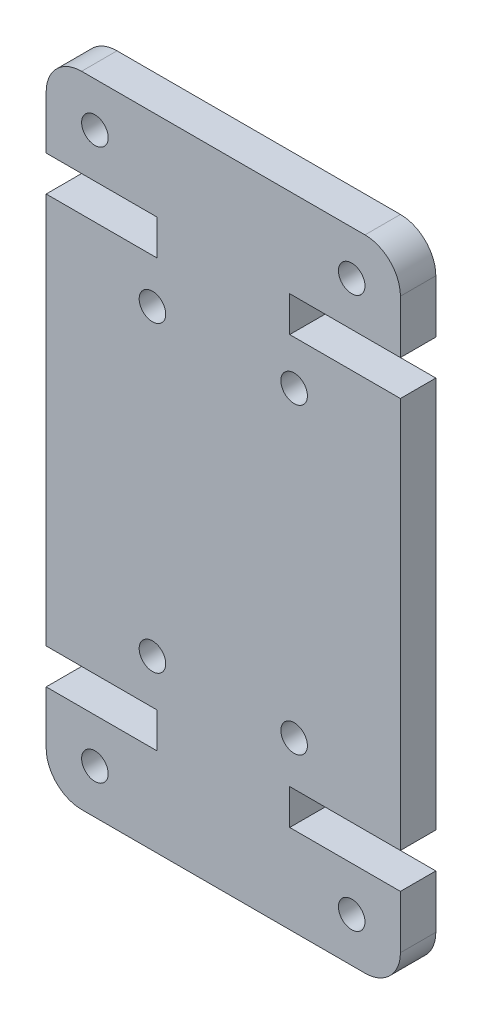
ISO-10303-21;
HEADER;
FILE_DESCRIPTION(('STEP AP214'),'2;1');
FILE_NAME('part.step','',(''),(''),'','','');
FILE_SCHEMA(('AUTOMOTIVE_DESIGN { 1 0 10303 214 1 1 1 1 }'));
ENDSEC;
DATA;
#1=APPLICATION_CONTEXT('core data for automotive mechanical design processes');
#2=APPLICATION_PROTOCOL_DEFINITION('international standard','automotive_design',2000,#1);
#3=PRODUCT_CONTEXT('',#1,'mechanical');
#4=PRODUCT('Part','Part','',(#3));
#5=PRODUCT_RELATED_PRODUCT_CATEGORY('part','',(#4));
#6=PRODUCT_DEFINITION_FORMATION('','',#4);
#7=PRODUCT_DEFINITION_CONTEXT('part definition',#1,'design');
#8=PRODUCT_DEFINITION('design','',#6,#7);
#9=PRODUCT_DEFINITION_SHAPE('','',#8);
#10=(LENGTH_UNIT() NAMED_UNIT(*) SI_UNIT(.MILLI.,.METRE.));
#11=(NAMED_UNIT(*) PLANE_ANGLE_UNIT() SI_UNIT($,.RADIAN.));
#12=(NAMED_UNIT(*) SI_UNIT($,.STERADIAN.) SOLID_ANGLE_UNIT());
#13=UNCERTAINTY_MEASURE_WITH_UNIT(LENGTH_MEASURE(1.E-05),#10,'distance_accuracy_value','');
#14=(GEOMETRIC_REPRESENTATION_CONTEXT(3) GLOBAL_UNCERTAINTY_ASSIGNED_CONTEXT((#13)) GLOBAL_UNIT_ASSIGNED_CONTEXT((#10,
#11,#12)) REPRESENTATION_CONTEXT('',''));
#15=CARTESIAN_POINT('',(0.,0.,0.));
#16=DIRECTION('',(0.,0.,1.));
#17=DIRECTION('',(1.,0.,0.));
#18=AXIS2_PLACEMENT_3D('',#15,#16,#17);
#19=CARTESIAN_POINT('',(1983.10984128656,1228.38470507667,2.));
#20=DIRECTION('',(0.,0.,1.));
#21=DIRECTION('',(1.,0.,0.));
#22=AXIS2_PLACEMENT_3D('',#19,#20,#21);
#23=PLANE('',#22);
#24=CARTESIAN_POINT('',(1982.35984128656,1227.88470507667,2.));
#25=DIRECTION('',(0.,0.,1.));
#26=DIRECTION('',(1.,0.,0.));
#27=AXIS2_PLACEMENT_3D('',#24,#25,#26);
#28=CIRCLE('',#27,0.750000000000028);
#29=CARTESIAN_POINT('',(1983.10984128656,1227.88470507667,2.));
#30=VERTEX_POINT('',#29);
#31=EDGE_CURVE('E467',#30,#30,#28,.T.);
#32=ORIENTED_EDGE('',*,*,#31,.F.);
#33=EDGE_LOOP('',(#32));
#34=FACE_BOUND('',#33,.T.);
#35=CARTESIAN_POINT('',(1982.35984128656,1196.78470507667,2.));
#36=DIRECTION('',(0.,0.,1.));
#37=DIRECTION('',(1.,0.,0.));
#38=AXIS2_PLACEMENT_3D('',#35,#36,#37);
#39=CIRCLE('',#38,0.750000000000028);
#40=CARTESIAN_POINT('',(1983.10984128656,1196.78470507667,2.));
#41=VERTEX_POINT('',#40);
#42=EDGE_CURVE('E479',#41,#41,#39,.T.);
#43=ORIENTED_EDGE('',*,*,#42,.F.);
#44=EDGE_LOOP('',(#43));
#45=FACE_BOUND('',#44,.T.);
#46=CARTESIAN_POINT('',(1979.10984128656,1203.78470507667,2.));
#47=DIRECTION('',(0.,0.,1.));
#48=DIRECTION('',(1.,0.,0.));
#49=AXIS2_PLACEMENT_3D('',#46,#47,#48);
#50=CIRCLE('',#49,0.750000000000028);
#51=CARTESIAN_POINT('',(1979.85984128656,1203.78470507667,2.));
#52=VERTEX_POINT('',#51);
#53=EDGE_CURVE('E491',#52,#52,#50,.T.);
#54=ORIENTED_EDGE('',*,*,#53,.F.);
#55=EDGE_LOOP('',(#54));
#56=FACE_BOUND('',#55,.T.);
#57=CARTESIAN_POINT('',(1979.10984128656,1220.88470507667,2.));
#58=DIRECTION('',(0.,0.,1.));
#59=DIRECTION('',(1.,0.,0.));
#60=AXIS2_PLACEMENT_3D('',#57,#58,#59);
#61=CIRCLE('',#60,0.750000000000028);
#62=CARTESIAN_POINT('',(1979.85984128656,1220.88470507667,2.));
#63=VERTEX_POINT('',#62);
#64=EDGE_CURVE('E233',#63,#63,#61,.T.);
#65=ORIENTED_EDGE('',*,*,#64,.F.);
#66=EDGE_LOOP('',(#65));
#67=FACE_BOUND('',#66,.T.);
#68=CARTESIAN_POINT('',(1983.10984128656,1228.38470507667,2.));
#69=DIRECTION('',(0.,0.,1.));
#70=DIRECTION('',(1.,0.,0.));
#71=AXIS2_PLACEMENT_3D('',#68,#69,#70);
#72=CIRCLE('',#71,2.);
#73=CARTESIAN_POINT('',(1985.10984128656,1228.38470507667,2.));
#74=VERTEX_POINT('',#73);
#75=CARTESIAN_POINT('',(1983.10984128656,1230.38470507667,2.));
#76=VERTEX_POINT('',#75);
#77=EDGE_CURVE('E276',#74,#76,#72,.T.);
#78=ORIENTED_EDGE('',*,*,#77,.T.);
#79=DIRECTION('',(-1.,0.,0.));
#80=VECTOR('',#79,1.);
#81=CARTESIAN_POINT('',(1967.10984128656,1230.38470507667,2.));
#82=LINE('',#81,#80);
#83=CARTESIAN_POINT('',(1967.10984128656,1230.38470507667,2.));
#84=VERTEX_POINT('',#83);
#85=EDGE_CURVE('E144',#76,#84,#82,.T.);
#86=ORIENTED_EDGE('',*,*,#85,.T.);
#87=CARTESIAN_POINT('',(1967.10984128656,1228.38470507667,2.));
#88=DIRECTION('',(0.,0.,1.));
#89=DIRECTION('',(1.,0.,0.));
#90=AXIS2_PLACEMENT_3D('',#87,#88,#89);
#91=CIRCLE('',#90,2.);
#92=CARTESIAN_POINT('',(1965.10984128656,1228.38470507667,2.));
#93=VERTEX_POINT('',#92);
#94=EDGE_CURVE('E339',#84,#93,#91,.T.);
#95=ORIENTED_EDGE('',*,*,#94,.T.);
#96=DIRECTION('',(-1.48029736616704E-13,-1.,0.));
#97=VECTOR('',#96,1.);
#98=CARTESIAN_POINT('',(1965.10984128656,1228.38470507667,2.));
#99=LINE('',#98,#97);
#100=CARTESIAN_POINT('',(1965.10984128656,1225.38470507667,2.));
#101=VERTEX_POINT('',#100);
#102=EDGE_CURVE('E358',#93,#101,#99,.T.);
#103=ORIENTED_EDGE('',*,*,#102,.T.);
#104=DIRECTION('',(1.,0.,0.));
#105=VECTOR('',#104,1.);
#106=CARTESIAN_POINT('',(1971.35984128656,1225.38470507667,2.));
#107=LINE('',#106,#105);
#108=CARTESIAN_POINT('',(1971.35984128656,1225.38470507667,2.));
#109=VERTEX_POINT('',#108);
#110=EDGE_CURVE('E355',#101,#109,#107,.T.);
#111=ORIENTED_EDGE('',*,*,#110,.T.);
#112=DIRECTION('',(0.,-1.,0.));
#113=VECTOR('',#112,1.);
#114=CARTESIAN_POINT('',(1971.35984128656,1225.38470507667,2.));
#115=LINE('',#114,#113);
#116=CARTESIAN_POINT('',(1971.35984128656,1223.38470507667,2.));
#117=VERTEX_POINT('',#116);
#118=EDGE_CURVE('E357',#109,#117,#115,.T.);
#119=ORIENTED_EDGE('',*,*,#118,.T.);
#120=DIRECTION('',(-1.,0.,0.));
#121=VECTOR('',#120,1.);
#122=CARTESIAN_POINT('',(1971.35984128656,1223.38470507667,2.));
#123=LINE('',#122,#121);
#124=CARTESIAN_POINT('',(1965.10984128656,1223.38470507667,2.));
#125=VERTEX_POINT('',#124);
#126=EDGE_CURVE('E360',#117,#125,#123,.T.);
#127=ORIENTED_EDGE('',*,*,#126,.T.);
#128=DIRECTION('',(0.,-1.,0.));
#129=VECTOR('',#128,1.);
#130=CARTESIAN_POINT('',(1965.10984128656,1223.38470507667,2.));
#131=LINE('',#130,#129);
#132=CARTESIAN_POINT('',(1965.10984128656,1201.28470507667,2.));
#133=VERTEX_POINT('',#132);
#134=EDGE_CURVE('E366',#125,#133,#131,.T.);
#135=ORIENTED_EDGE('',*,*,#134,.T.);
#136=DIRECTION('',(1.,0.,0.));
#137=VECTOR('',#136,1.);
#138=CARTESIAN_POINT('',(1971.35984128656,1201.28470507667,2.));
#139=LINE('',#138,#137);
#140=CARTESIAN_POINT('',(1971.35984128656,1201.28470507667,2.));
#141=VERTEX_POINT('',#140);
#142=EDGE_CURVE('E368',#133,#141,#139,.T.);
#143=ORIENTED_EDGE('',*,*,#142,.T.);
#144=DIRECTION('',(0.,-1.,0.));
#145=VECTOR('',#144,1.);
#146=CARTESIAN_POINT('',(1971.35984128656,1199.28470507667,2.));
#147=LINE('',#146,#145);
#148=CARTESIAN_POINT('',(1971.35984128656,1199.28470507667,2.));
#149=VERTEX_POINT('',#148);
#150=EDGE_CURVE('E370',#141,#149,#147,.T.);
#151=ORIENTED_EDGE('',*,*,#150,.T.);
#152=DIRECTION('',(-1.,0.,0.));
#153=VECTOR('',#152,1.);
#154=CARTESIAN_POINT('',(1971.35984128656,1199.28470507667,2.));
#155=LINE('',#154,#153);
#156=CARTESIAN_POINT('',(1965.10984128656,1199.28470507667,2.));
#157=VERTEX_POINT('',#156);
#158=EDGE_CURVE('E372',#149,#157,#155,.T.);
#159=ORIENTED_EDGE('',*,*,#158,.T.);
#160=DIRECTION('',(1.48029736616704E-13,-1.,0.));
#161=VECTOR('',#160,1.);
#162=CARTESIAN_POINT('',(1965.10984128656,1196.28470507667,2.));
#163=LINE('',#162,#161);
#164=CARTESIAN_POINT('',(1965.10984128656,1196.28470507667,2.));
#165=VERTEX_POINT('',#164);
#166=EDGE_CURVE('E374',#157,#165,#163,.T.);
#167=ORIENTED_EDGE('',*,*,#166,.T.);
#168=CARTESIAN_POINT('',(1967.10984128656,1196.28470507667,2.));
#169=DIRECTION('',(0.,0.,1.));
#170=DIRECTION('',(1.,0.,0.));
#171=AXIS2_PLACEMENT_3D('',#168,#169,#170);
#172=CIRCLE('',#171,2.);
#173=CARTESIAN_POINT('',(1967.10984128656,1194.28470507667,2.));
#174=VERTEX_POINT('',#173);
#175=EDGE_CURVE('E376',#165,#174,#172,.T.);
#176=ORIENTED_EDGE('',*,*,#175,.T.);
#177=DIRECTION('',(1.,0.,0.));
#178=VECTOR('',#177,1.);
#179=CARTESIAN_POINT('',(1967.10984128656,1194.28470507667,2.));
#180=LINE('',#179,#178);
#181=CARTESIAN_POINT('',(1983.10984128656,1194.28470507667,2.));
#182=VERTEX_POINT('',#181);
#183=EDGE_CURVE('E378',#174,#182,#180,.T.);
#184=ORIENTED_EDGE('',*,*,#183,.T.);
#185=CARTESIAN_POINT('',(1983.10984128656,1196.28470507667,2.));
#186=DIRECTION('',(0.,0.,1.));
#187=DIRECTION('',(1.,0.,0.));
#188=AXIS2_PLACEMENT_3D('',#185,#186,#187);
#189=CIRCLE('',#188,2.);
#190=CARTESIAN_POINT('',(1985.10984128656,1196.28470507667,2.));
#191=VERTEX_POINT('',#190);
#192=EDGE_CURVE('E380',#182,#191,#189,.T.);
#193=ORIENTED_EDGE('',*,*,#192,.T.);
#194=DIRECTION('',(2.96059473233408E-13,1.,0.));
#195=VECTOR('',#194,1.);
#196=CARTESIAN_POINT('',(1985.10984128656,1199.28470507667,2.));
#197=LINE('',#196,#195);
#198=CARTESIAN_POINT('',(1985.10984128656,1199.28470507667,2.));
#199=VERTEX_POINT('',#198);
#200=EDGE_CURVE('E382',#191,#199,#197,.T.);
#201=ORIENTED_EDGE('',*,*,#200,.T.);
#202=DIRECTION('',(-1.,0.,0.));
#203=VECTOR('',#202,1.);
#204=CARTESIAN_POINT('',(1978.85984128656,1199.28470507667,2.));
#205=LINE('',#204,#203);
#206=CARTESIAN_POINT('',(1978.85984128656,1199.28470507667,2.));
#207=VERTEX_POINT('',#206);
#208=EDGE_CURVE('E384',#199,#207,#205,.T.);
#209=ORIENTED_EDGE('',*,*,#208,.T.);
#210=DIRECTION('',(0.,1.,0.));
#211=VECTOR('',#210,1.);
#212=CARTESIAN_POINT('',(1978.85984128656,1199.28470507667,2.));
#213=LINE('',#212,#211);
#214=CARTESIAN_POINT('',(1978.85984128656,1201.28470507667,2.));
#215=VERTEX_POINT('',#214);
#216=EDGE_CURVE('E386',#207,#215,#213,.T.);
#217=ORIENTED_EDGE('',*,*,#216,.T.);
#218=DIRECTION('',(1.,0.,0.));
#219=VECTOR('',#218,1.);
#220=CARTESIAN_POINT('',(1978.85984128656,1201.28470507667,2.));
#221=LINE('',#220,#219);
#222=CARTESIAN_POINT('',(1985.10984128656,1201.28470507667,2.));
#223=VERTEX_POINT('',#222);
#224=EDGE_CURVE('E388',#215,#223,#221,.T.);
#225=ORIENTED_EDGE('',*,*,#224,.T.);
#226=DIRECTION('',(0.,1.,0.));
#227=VECTOR('',#226,1.);
#228=CARTESIAN_POINT('',(1985.10984128656,1223.38470507667,2.));
#229=LINE('',#228,#227);
#230=CARTESIAN_POINT('',(1985.10984128656,1223.38470507667,2.));
#231=VERTEX_POINT('',#230);
#232=EDGE_CURVE('E390',#223,#231,#229,.T.);
#233=ORIENTED_EDGE('',*,*,#232,.T.);
#234=DIRECTION('',(-1.,0.,0.));
#235=VECTOR('',#234,1.);
#236=CARTESIAN_POINT('',(1978.85984128656,1223.38470507667,2.));
#237=LINE('',#236,#235);
#238=CARTESIAN_POINT('',(1978.85984128656,1223.38470507667,2.));
#239=VERTEX_POINT('',#238);
#240=EDGE_CURVE('E211',#231,#239,#237,.T.);
#241=ORIENTED_EDGE('',*,*,#240,.T.);
#242=DIRECTION('',(0.,1.,0.));
#243=VECTOR('',#242,1.);
#244=CARTESIAN_POINT('',(1978.85984128656,1225.38470507667,2.));
#245=LINE('',#244,#243);
#246=CARTESIAN_POINT('',(1978.85984128656,1225.38470507667,2.));
#247=VERTEX_POINT('',#246);
#248=EDGE_CURVE('E205',#239,#247,#245,.T.);
#249=ORIENTED_EDGE('',*,*,#248,.T.);
#250=DIRECTION('',(1.,0.,0.));
#251=VECTOR('',#250,1.);
#252=CARTESIAN_POINT('',(1978.85984128656,1225.38470507667,2.));
#253=LINE('',#252,#251);
#254=CARTESIAN_POINT('',(1985.10984128656,1225.38470507667,2.));
#255=VERTEX_POINT('',#254);
#256=EDGE_CURVE('E209',#247,#255,#253,.T.);
#257=ORIENTED_EDGE('',*,*,#256,.T.);
#258=DIRECTION('',(-2.96059473233408E-13,1.,0.));
#259=VECTOR('',#258,1.);
#260=CARTESIAN_POINT('',(1985.10984128656,1225.38470507667,2.));
#261=LINE('',#260,#259);
#262=EDGE_CURVE('E53',#255,#74,#261,.T.);
#263=ORIENTED_EDGE('',*,*,#262,.T.);
#264=EDGE_LOOP('',(#78,#86,#95,#103,#111,#119,#127,#135,#143,#151,#159,#167,#176,#184,#193,#201,
#209,#217,#225,#233,#241,#249,#257,#263));
#265=FACE_BOUND('',#264,.T.);
#266=CARTESIAN_POINT('',(1971.10984128656,1220.88470507667,2.));
#267=DIRECTION('',(0.,0.,1.));
#268=DIRECTION('',(1.,0.,0.));
#269=AXIS2_PLACEMENT_3D('',#266,#267,#268);
#270=CIRCLE('',#269,0.750000000000028);
#271=CARTESIAN_POINT('',(1971.85984128656,1220.88470507667,2.));
#272=VERTEX_POINT('',#271);
#273=EDGE_CURVE('E497',#272,#272,#270,.T.);
#274=ORIENTED_EDGE('',*,*,#273,.F.);
#275=EDGE_LOOP('',(#274));
#276=FACE_BOUND('',#275,.T.);
#277=CARTESIAN_POINT('',(1971.10984128656,1203.78470507667,2.));
#278=DIRECTION('',(0.,0.,1.));
#279=DIRECTION('',(1.,0.,0.));
#280=AXIS2_PLACEMENT_3D('',#277,#278,#279);
#281=CIRCLE('',#280,0.750000000000028);
#282=CARTESIAN_POINT('',(1971.85984128656,1203.78470507667,2.));
#283=VERTEX_POINT('',#282);
#284=EDGE_CURVE('E485',#283,#283,#281,.T.);
#285=ORIENTED_EDGE('',*,*,#284,.F.);
#286=EDGE_LOOP('',(#285));
#287=FACE_BOUND('',#286,.T.);
#288=CARTESIAN_POINT('',(1967.85984128656,1196.78470507667,2.));
#289=DIRECTION('',(0.,0.,1.));
#290=DIRECTION('',(1.,0.,0.));
#291=AXIS2_PLACEMENT_3D('',#288,#289,#290);
#292=CIRCLE('',#291,0.750000000000028);
#293=CARTESIAN_POINT('',(1968.60984128656,1196.78470507667,2.));
#294=VERTEX_POINT('',#293);
#295=EDGE_CURVE('E473',#294,#294,#292,.T.);
#296=ORIENTED_EDGE('',*,*,#295,.F.);
#297=EDGE_LOOP('',(#296));
#298=FACE_BOUND('',#297,.T.);
#299=CARTESIAN_POINT('',(1967.85984128656,1227.88470507667,2.));
#300=DIRECTION('',(0.,0.,1.));
#301=DIRECTION('',(1.,0.,0.));
#302=AXIS2_PLACEMENT_3D('',#299,#300,#301);
#303=CIRCLE('',#302,0.750000000000028);
#304=CARTESIAN_POINT('',(1968.60984128656,1227.88470507667,2.));
#305=VERTEX_POINT('',#304);
#306=EDGE_CURVE('E458',#305,#305,#303,.T.);
#307=ORIENTED_EDGE('',*,*,#306,.F.);
#308=EDGE_LOOP('',(#307));
#309=FACE_BOUND('',#308,.T.);
#310=ADVANCED_FACE('F36',(#34,#45,#56,#67,#265,#276,#287,#298,#309),#23,.T.);
#311=CARTESIAN_POINT('',(1983.10984128656,1228.38470507667,0.));
#312=DIRECTION('',(0.,0.,1.));
#313=DIRECTION('',(1.,0.,0.));
#314=AXIS2_PLACEMENT_3D('',#311,#312,#313);
#315=PLANE('',#314);
#316=CARTESIAN_POINT('',(1982.35984128656,1227.88470507667,0.));
#317=DIRECTION('',(0.,0.,1.));
#318=DIRECTION('',(1.,0.,0.));
#319=AXIS2_PLACEMENT_3D('',#316,#317,#318);
#320=CIRCLE('',#319,0.750000000000028);
#321=CARTESIAN_POINT('',(1983.10984128656,1227.88470507667,0.));
#322=VERTEX_POINT('',#321);
#323=EDGE_CURVE('E464',#322,#322,#320,.T.);
#324=ORIENTED_EDGE('',*,*,#323,.T.);
#325=EDGE_LOOP('',(#324));
#326=FACE_BOUND('',#325,.T.);
#327=CARTESIAN_POINT('',(1982.35984128656,1196.78470507667,0.));
#328=DIRECTION('',(0.,0.,1.));
#329=DIRECTION('',(1.,0.,0.));
#330=AXIS2_PLACEMENT_3D('',#327,#328,#329);
#331=CIRCLE('',#330,0.750000000000028);
#332=CARTESIAN_POINT('',(1983.10984128656,1196.78470507667,0.));
#333=VERTEX_POINT('',#332);
#334=EDGE_CURVE('E476',#333,#333,#331,.T.);
#335=ORIENTED_EDGE('',*,*,#334,.T.);
#336=EDGE_LOOP('',(#335));
#337=FACE_BOUND('',#336,.T.);
#338=CARTESIAN_POINT('',(1979.10984128656,1203.78470507667,0.));
#339=DIRECTION('',(0.,0.,1.));
#340=DIRECTION('',(1.,0.,0.));
#341=AXIS2_PLACEMENT_3D('',#338,#339,#340);
#342=CIRCLE('',#341,0.750000000000028);
#343=CARTESIAN_POINT('',(1979.85984128656,1203.78470507667,0.));
#344=VERTEX_POINT('',#343);
#345=EDGE_CURVE('E488',#344,#344,#342,.T.);
#346=ORIENTED_EDGE('',*,*,#345,.T.);
#347=EDGE_LOOP('',(#346));
#348=FACE_BOUND('',#347,.T.);
#349=CARTESIAN_POINT('',(1979.10984128656,1220.88470507667,0.));
#350=DIRECTION('',(0.,0.,1.));
#351=DIRECTION('',(1.,0.,0.));
#352=AXIS2_PLACEMENT_3D('',#349,#350,#351);
#353=CIRCLE('',#352,0.750000000000028);
#354=CARTESIAN_POINT('',(1979.85984128656,1220.88470507667,0.));
#355=VERTEX_POINT('',#354);
#356=EDGE_CURVE('E500',#355,#355,#353,.T.);
#357=ORIENTED_EDGE('',*,*,#356,.T.);
#358=EDGE_LOOP('',(#357));
#359=FACE_BOUND('',#358,.T.);
#360=CARTESIAN_POINT('',(1983.10984128656,1228.38470507667,0.));
#361=DIRECTION('',(0.,0.,1.));
#362=DIRECTION('',(1.,0.,0.));
#363=AXIS2_PLACEMENT_3D('',#360,#361,#362);
#364=CIRCLE('',#363,2.);
#365=CARTESIAN_POINT('',(1985.10984128656,1228.38470507667,0.));
#366=VERTEX_POINT('',#365);
#367=CARTESIAN_POINT('',(1983.10984128656,1230.38470507667,0.));
#368=VERTEX_POINT('',#367);
#369=EDGE_CURVE('E229',#366,#368,#364,.T.);
#370=ORIENTED_EDGE('',*,*,#369,.F.);
#371=DIRECTION('',(-2.96059473233408E-13,1.,0.));
#372=VECTOR('',#371,1.);
#373=CARTESIAN_POINT('',(1985.10984128656,1225.38470507667,0.));
#374=LINE('',#373,#372);
#375=CARTESIAN_POINT('',(1985.10984128656,1225.38470507667,0.));
#376=VERTEX_POINT('',#375);
#377=EDGE_CURVE('E136',#376,#366,#374,.T.);
#378=ORIENTED_EDGE('',*,*,#377,.F.);
#379=DIRECTION('',(1.,0.,0.));
#380=VECTOR('',#379,1.);
#381=CARTESIAN_POINT('',(1978.85984128656,1225.38470507667,0.));
#382=LINE('',#381,#380);
#383=CARTESIAN_POINT('',(1978.85984128656,1225.38470507667,0.));
#384=VERTEX_POINT('',#383);
#385=EDGE_CURVE('E130',#384,#376,#382,.T.);
#386=ORIENTED_EDGE('',*,*,#385,.F.);
#387=DIRECTION('',(0.,1.,0.));
#388=VECTOR('',#387,1.);
#389=CARTESIAN_POINT('',(1978.85984128656,1225.38470507667,0.));
#390=LINE('',#389,#388);
#391=CARTESIAN_POINT('',(1978.85984128656,1223.38470507667,0.));
#392=VERTEX_POINT('',#391);
#393=EDGE_CURVE('E219',#392,#384,#390,.T.);
#394=ORIENTED_EDGE('',*,*,#393,.F.);
#395=DIRECTION('',(-1.,0.,0.));
#396=VECTOR('',#395,1.);
#397=CARTESIAN_POINT('',(1978.85984128656,1223.38470507667,0.));
#398=LINE('',#397,#396);
#399=CARTESIAN_POINT('',(1985.10984128656,1223.38470507667,0.));
#400=VERTEX_POINT('',#399);
#401=EDGE_CURVE('E271',#400,#392,#398,.T.);
#402=ORIENTED_EDGE('',*,*,#401,.F.);
#403=DIRECTION('',(0.,1.,0.));
#404=VECTOR('',#403,1.);
#405=CARTESIAN_POINT('',(1985.10984128656,1223.38470507667,0.));
#406=LINE('',#405,#404);
#407=CARTESIAN_POINT('',(1985.10984128656,1201.28470507667,0.));
#408=VERTEX_POINT('',#407);
#409=EDGE_CURVE('E269',#408,#400,#406,.T.);
#410=ORIENTED_EDGE('',*,*,#409,.F.);
#411=DIRECTION('',(1.,0.,0.));
#412=VECTOR('',#411,1.);
#413=CARTESIAN_POINT('',(1978.85984128656,1201.28470507667,0.));
#414=LINE('',#413,#412);
#415=CARTESIAN_POINT('',(1978.85984128656,1201.28470507667,0.));
#416=VERTEX_POINT('',#415);
#417=EDGE_CURVE('E267',#416,#408,#414,.T.);
#418=ORIENTED_EDGE('',*,*,#417,.F.);
#419=DIRECTION('',(0.,1.,0.));
#420=VECTOR('',#419,1.);
#421=CARTESIAN_POINT('',(1978.85984128656,1199.28470507667,0.));
#422=LINE('',#421,#420);
#423=CARTESIAN_POINT('',(1978.85984128656,1199.28470507667,0.));
#424=VERTEX_POINT('',#423);
#425=EDGE_CURVE('E265',#424,#416,#422,.T.);
#426=ORIENTED_EDGE('',*,*,#425,.F.);
#427=DIRECTION('',(-1.,0.,0.));
#428=VECTOR('',#427,1.);
#429=CARTESIAN_POINT('',(1978.85984128656,1199.28470507667,0.));
#430=LINE('',#429,#428);
#431=CARTESIAN_POINT('',(1985.10984128656,1199.28470507667,0.));
#432=VERTEX_POINT('',#431);
#433=EDGE_CURVE('E263',#432,#424,#430,.T.);
#434=ORIENTED_EDGE('',*,*,#433,.F.);
#435=DIRECTION('',(2.96059473233408E-13,1.,0.));
#436=VECTOR('',#435,1.);
#437=CARTESIAN_POINT('',(1985.10984128656,1199.28470507667,0.));
#438=LINE('',#437,#436);
#439=CARTESIAN_POINT('',(1985.10984128656,1196.28470507667,0.));
#440=VERTEX_POINT('',#439);
#441=EDGE_CURVE('E261',#440,#432,#438,.T.);
#442=ORIENTED_EDGE('',*,*,#441,.F.);
#443=CARTESIAN_POINT('',(1983.10984128656,1196.28470507667,0.));
#444=DIRECTION('',(0.,0.,1.));
#445=DIRECTION('',(1.,0.,0.));
#446=AXIS2_PLACEMENT_3D('',#443,#444,#445);
#447=CIRCLE('',#446,2.);
#448=CARTESIAN_POINT('',(1983.10984128656,1194.28470507667,0.));
#449=VERTEX_POINT('',#448);
#450=EDGE_CURVE('E259',#449,#440,#447,.T.);
#451=ORIENTED_EDGE('',*,*,#450,.F.);
#452=DIRECTION('',(1.,0.,0.));
#453=VECTOR('',#452,1.);
#454=CARTESIAN_POINT('',(1967.10984128656,1194.28470507667,0.));
#455=LINE('',#454,#453);
#456=CARTESIAN_POINT('',(1967.10984128656,1194.28470507667,0.));
#457=VERTEX_POINT('',#456);
#458=EDGE_CURVE('E257',#457,#449,#455,.T.);
#459=ORIENTED_EDGE('',*,*,#458,.F.);
#460=CARTESIAN_POINT('',(1967.10984128656,1196.28470507667,0.));
#461=DIRECTION('',(0.,0.,1.));
#462=DIRECTION('',(1.,0.,0.));
#463=AXIS2_PLACEMENT_3D('',#460,#461,#462);
#464=CIRCLE('',#463,2.);
#465=CARTESIAN_POINT('',(1965.10984128656,1196.28470507667,0.));
#466=VERTEX_POINT('',#465);
#467=EDGE_CURVE('E255',#466,#457,#464,.T.);
#468=ORIENTED_EDGE('',*,*,#467,.F.);
#469=DIRECTION('',(1.48029736616704E-13,-1.,0.));
#470=VECTOR('',#469,1.);
#471=CARTESIAN_POINT('',(1965.10984128656,1196.28470507667,0.));
#472=LINE('',#471,#470);
#473=CARTESIAN_POINT('',(1965.10984128656,1199.28470507667,0.));
#474=VERTEX_POINT('',#473);
#475=EDGE_CURVE('E253',#474,#466,#472,.T.);
#476=ORIENTED_EDGE('',*,*,#475,.F.);
#477=DIRECTION('',(-1.,0.,0.));
#478=VECTOR('',#477,1.);
#479=CARTESIAN_POINT('',(1971.35984128656,1199.28470507667,0.));
#480=LINE('',#479,#478);
#481=CARTESIAN_POINT('',(1971.35984128656,1199.28470507667,0.));
#482=VERTEX_POINT('',#481);
#483=EDGE_CURVE('E251',#482,#474,#480,.T.);
#484=ORIENTED_EDGE('',*,*,#483,.F.);
#485=DIRECTION('',(0.,-1.,0.));
#486=VECTOR('',#485,1.);
#487=CARTESIAN_POINT('',(1971.35984128656,1199.28470507667,0.));
#488=LINE('',#487,#486);
#489=CARTESIAN_POINT('',(1971.35984128656,1201.28470507667,0.));
#490=VERTEX_POINT('',#489);
#491=EDGE_CURVE('E249',#490,#482,#488,.T.);
#492=ORIENTED_EDGE('',*,*,#491,.F.);
#493=DIRECTION('',(1.,0.,0.));
#494=VECTOR('',#493,1.);
#495=CARTESIAN_POINT('',(1971.35984128656,1201.28470507667,0.));
#496=LINE('',#495,#494);
#497=CARTESIAN_POINT('',(1965.10984128656,1201.28470507667,0.));
#498=VERTEX_POINT('',#497);
#499=EDGE_CURVE('E247',#498,#490,#496,.T.);
#500=ORIENTED_EDGE('',*,*,#499,.F.);
#501=DIRECTION('',(0.,-1.,0.));
#502=VECTOR('',#501,1.);
#503=CARTESIAN_POINT('',(1965.10984128656,1223.38470507667,0.));
#504=LINE('',#503,#502);
#505=CARTESIAN_POINT('',(1965.10984128656,1223.38470507667,0.));
#506=VERTEX_POINT('',#505);
#507=EDGE_CURVE('E245',#506,#498,#504,.T.);
#508=ORIENTED_EDGE('',*,*,#507,.F.);
#509=DIRECTION('',(-1.,0.,0.));
#510=VECTOR('',#509,1.);
#511=CARTESIAN_POINT('',(1971.35984128656,1223.38470507667,0.));
#512=LINE('',#511,#510);
#513=CARTESIAN_POINT('',(1971.35984128656,1223.38470507667,0.));
#514=VERTEX_POINT('',#513);
#515=EDGE_CURVE('E243',#514,#506,#512,.T.);
#516=ORIENTED_EDGE('',*,*,#515,.F.);
#517=DIRECTION('',(0.,-1.,0.));
#518=VECTOR('',#517,1.);
#519=CARTESIAN_POINT('',(1971.35984128656,1225.38470507667,0.));
#520=LINE('',#519,#518);
#521=CARTESIAN_POINT('',(1971.35984128656,1225.38470507667,0.));
#522=VERTEX_POINT('',#521);
#523=EDGE_CURVE('E241',#522,#514,#520,.T.);
#524=ORIENTED_EDGE('',*,*,#523,.F.);
#525=DIRECTION('',(1.,0.,0.));
#526=VECTOR('',#525,1.);
#527=CARTESIAN_POINT('',(1971.35984128656,1225.38470507667,0.));
#528=LINE('',#527,#526);
#529=CARTESIAN_POINT('',(1965.10984128656,1225.38470507667,0.));
#530=VERTEX_POINT('',#529);
#531=EDGE_CURVE('E239',#530,#522,#528,.T.);
#532=ORIENTED_EDGE('',*,*,#531,.F.);
#533=DIRECTION('',(-1.48029736616704E-13,-1.,0.));
#534=VECTOR('',#533,1.);
#535=CARTESIAN_POINT('',(1965.10984128656,1228.38470507667,0.));
#536=LINE('',#535,#534);
#537=CARTESIAN_POINT('',(1965.10984128656,1228.38470507667,0.));
#538=VERTEX_POINT('',#537);
#539=EDGE_CURVE('E237',#538,#530,#536,.T.);
#540=ORIENTED_EDGE('',*,*,#539,.F.);
#541=CARTESIAN_POINT('',(1967.10984128656,1228.38470507667,0.));
#542=DIRECTION('',(0.,0.,1.));
#543=DIRECTION('',(1.,0.,0.));
#544=AXIS2_PLACEMENT_3D('',#541,#542,#543);
#545=CIRCLE('',#544,2.);
#546=CARTESIAN_POINT('',(1967.10984128656,1230.38470507667,0.));
#547=VERTEX_POINT('',#546);
#548=EDGE_CURVE('E235',#547,#538,#545,.T.);
#549=ORIENTED_EDGE('',*,*,#548,.F.);
#550=DIRECTION('',(-1.,0.,0.));
#551=VECTOR('',#550,1.);
#552=CARTESIAN_POINT('',(1967.10984128656,1230.38470507667,0.));
#553=LINE('',#552,#551);
#554=EDGE_CURVE('E232',#368,#547,#553,.T.);
#555=ORIENTED_EDGE('',*,*,#554,.F.);
#556=EDGE_LOOP('',(#370,#378,#386,#394,#402,#410,#418,#426,#434,#442,#451,#459,#468,#476,#484,
#492,#500,#508,#516,#524,#532,#540,#549,#555));
#557=FACE_BOUND('',#556,.T.);
#558=CARTESIAN_POINT('',(1971.10984128656,1220.88470507667,0.));
#559=DIRECTION('',(0.,0.,1.));
#560=DIRECTION('',(1.,0.,0.));
#561=AXIS2_PLACEMENT_3D('',#558,#559,#560);
#562=CIRCLE('',#561,0.750000000000028);
#563=CARTESIAN_POINT('',(1971.85984128656,1220.88470507667,0.));
#564=VERTEX_POINT('',#563);
#565=EDGE_CURVE('E494',#564,#564,#562,.T.);
#566=ORIENTED_EDGE('',*,*,#565,.T.);
#567=EDGE_LOOP('',(#566));
#568=FACE_BOUND('',#567,.T.);
#569=CARTESIAN_POINT('',(1971.10984128656,1203.78470507667,0.));
#570=DIRECTION('',(0.,0.,1.));
#571=DIRECTION('',(1.,0.,0.));
#572=AXIS2_PLACEMENT_3D('',#569,#570,#571);
#573=CIRCLE('',#572,0.750000000000028);
#574=CARTESIAN_POINT('',(1971.85984128656,1203.78470507667,0.));
#575=VERTEX_POINT('',#574);
#576=EDGE_CURVE('E482',#575,#575,#573,.T.);
#577=ORIENTED_EDGE('',*,*,#576,.T.);
#578=EDGE_LOOP('',(#577));
#579=FACE_BOUND('',#578,.T.);
#580=CARTESIAN_POINT('',(1967.85984128656,1196.78470507667,0.));
#581=DIRECTION('',(0.,0.,1.));
#582=DIRECTION('',(1.,0.,0.));
#583=AXIS2_PLACEMENT_3D('',#580,#581,#582);
#584=CIRCLE('',#583,0.750000000000028);
#585=CARTESIAN_POINT('',(1968.60984128656,1196.78470507667,0.));
#586=VERTEX_POINT('',#585);
#587=EDGE_CURVE('E470',#586,#586,#584,.T.);
#588=ORIENTED_EDGE('',*,*,#587,.T.);
#589=EDGE_LOOP('',(#588));
#590=FACE_BOUND('',#589,.T.);
#591=CARTESIAN_POINT('',(1967.85984128656,1227.88470507667,0.));
#592=DIRECTION('',(0.,0.,1.));
#593=DIRECTION('',(1.,0.,0.));
#594=AXIS2_PLACEMENT_3D('',#591,#592,#593);
#595=CIRCLE('',#594,0.750000000000028);
#596=CARTESIAN_POINT('',(1968.60984128656,1227.88470507667,0.));
#597=VERTEX_POINT('',#596);
#598=EDGE_CURVE('E461',#597,#597,#595,.T.);
#599=ORIENTED_EDGE('',*,*,#598,.T.);
#600=EDGE_LOOP('',(#599));
#601=FACE_BOUND('',#600,.T.);
#602=ADVANCED_FACE('F343',(#326,#337,#348,#359,#557,#568,#579,#590,#601),#315,.F.);
#603=CARTESIAN_POINT('',(1983.10984128656,1228.38470507667,2.));
#604=DIRECTION('',(0.,0.,-1.));
#605=DIRECTION('',(-1.,0.,0.));
#606=AXIS2_PLACEMENT_3D('',#603,#604,#605);
#607=CYLINDRICAL_SURFACE('',#606,2.);
#608=ORIENTED_EDGE('',*,*,#369,.T.);
#609=DIRECTION('',(0.,0.,-1.));
#610=VECTOR('',#609,1.);
#611=CARTESIAN_POINT('',(1983.10984128656,1230.38470507667,2.));
#612=LINE('',#611,#610);
#613=EDGE_CURVE('E11',#76,#368,#612,.T.);
#614=ORIENTED_EDGE('',*,*,#613,.F.);
#615=ORIENTED_EDGE('',*,*,#77,.F.);
#616=DIRECTION('',(0.,0.,-1.));
#617=VECTOR('',#616,1.);
#618=CARTESIAN_POINT('',(1985.10984128656,1228.38470507667,2.));
#619=LINE('',#618,#617);
#620=EDGE_CURVE('E225',#74,#366,#619,.T.);
#621=ORIENTED_EDGE('',*,*,#620,.T.);
#622=EDGE_LOOP('',(#608,#614,#615,#621));
#623=FACE_BOUND('',#622,.T.);
#624=ADVANCED_FACE('F38',(#623),#607,.T.);
#625=CARTESIAN_POINT('',(1967.10984128656,1230.38470507667,2.));
#626=DIRECTION('',(0.,-1.,0.));
#627=DIRECTION('',(0.,0.,-1.));
#628=AXIS2_PLACEMENT_3D('',#625,#626,#627);
#629=PLANE('',#628);
#630=ORIENTED_EDGE('',*,*,#554,.T.);
#631=DIRECTION('',(0.,0.,-1.));
#632=VECTOR('',#631,1.);
#633=CARTESIAN_POINT('',(1967.10984128656,1230.38470507667,2.));
#634=LINE('',#633,#632);
#635=EDGE_CURVE('E45',#84,#547,#634,.T.);
#636=ORIENTED_EDGE('',*,*,#635,.F.);
#637=ORIENTED_EDGE('',*,*,#85,.F.);
#638=ORIENTED_EDGE('',*,*,#613,.T.);
#639=EDGE_LOOP('',(#630,#636,#637,#638));
#640=FACE_BOUND('',#639,.T.);
#641=ADVANCED_FACE('F735',(#640),#629,.F.);
#642=CARTESIAN_POINT('',(1967.10984128656,1228.38470507667,2.));
#643=DIRECTION('',(0.,0.,-1.));
#644=DIRECTION('',(-1.,0.,0.));
#645=AXIS2_PLACEMENT_3D('',#642,#643,#644);
#646=CYLINDRICAL_SURFACE('',#645,2.);
#647=ORIENTED_EDGE('',*,*,#548,.T.);
#648=DIRECTION('',(0.,0.,-1.));
#649=VECTOR('',#648,1.);
#650=CARTESIAN_POINT('',(1965.10984128656,1228.38470507667,2.));
#651=LINE('',#650,#649);
#652=EDGE_CURVE('E331',#93,#538,#651,.T.);
#653=ORIENTED_EDGE('',*,*,#652,.F.);
#654=ORIENTED_EDGE('',*,*,#94,.F.);
#655=ORIENTED_EDGE('',*,*,#635,.T.);
#656=EDGE_LOOP('',(#647,#653,#654,#655));
#657=FACE_BOUND('',#656,.T.);
#658=ADVANCED_FACE('F337',(#657),#646,.T.);
#659=CARTESIAN_POINT('',(1965.10984128656,1228.38470507667,2.));
#660=DIRECTION('',(1.,-1.48029736616704E-13,0.));
#661=DIRECTION('',(1.48029736616704E-13,1.,0.));
#662=AXIS2_PLACEMENT_3D('',#659,#660,#661);
#663=PLANE('',#662);
#664=ORIENTED_EDGE('',*,*,#539,.T.);
#665=DIRECTION('',(0.,0.,-1.));
#666=VECTOR('',#665,1.);
#667=CARTESIAN_POINT('',(1965.10984128656,1225.38470507667,2.));
#668=LINE('',#667,#666);
#669=EDGE_CURVE('E328',#101,#530,#668,.T.);
#670=ORIENTED_EDGE('',*,*,#669,.F.);
#671=ORIENTED_EDGE('',*,*,#102,.F.);
#672=ORIENTED_EDGE('',*,*,#652,.T.);
#673=EDGE_LOOP('',(#664,#670,#671,#672));
#674=FACE_BOUND('',#673,.T.);
#675=ADVANCED_FACE('F349',(#674),#663,.F.);
#676=CARTESIAN_POINT('',(1971.35984128656,1225.38470507667,2.));
#677=DIRECTION('',(0.,1.,0.));
#678=DIRECTION('',(0.,0.,1.));
#679=AXIS2_PLACEMENT_3D('',#676,#677,#678);
#680=PLANE('',#679);
#681=ORIENTED_EDGE('',*,*,#531,.T.);
#682=DIRECTION('',(0.,0.,-1.));
#683=VECTOR('',#682,1.);
#684=CARTESIAN_POINT('',(1971.35984128656,1225.38470507667,2.));
#685=LINE('',#684,#683);
#686=EDGE_CURVE('E325',#109,#522,#685,.T.);
#687=ORIENTED_EDGE('',*,*,#686,.F.);
#688=ORIENTED_EDGE('',*,*,#110,.F.);
#689=ORIENTED_EDGE('',*,*,#669,.T.);
#690=EDGE_LOOP('',(#681,#687,#688,#689));
#691=FACE_BOUND('',#690,.T.);
#692=ADVANCED_FACE('F353',(#691),#680,.F.);
#693=CARTESIAN_POINT('',(1971.35984128656,1225.38470507667,2.));
#694=DIRECTION('',(1.,0.,0.));
#695=DIRECTION('',(0.,0.,-1.));
#696=AXIS2_PLACEMENT_3D('',#693,#694,#695);
#697=PLANE('',#696);
#698=ORIENTED_EDGE('',*,*,#523,.T.);
#699=DIRECTION('',(0.,0.,-1.));
#700=VECTOR('',#699,1.);
#701=CARTESIAN_POINT('',(1971.35984128656,1223.38470507667,2.));
#702=LINE('',#701,#700);
#703=EDGE_CURVE('E322',#117,#514,#702,.T.);
#704=ORIENTED_EDGE('',*,*,#703,.F.);
#705=ORIENTED_EDGE('',*,*,#118,.F.);
#706=ORIENTED_EDGE('',*,*,#686,.T.);
#707=EDGE_LOOP('',(#698,#704,#705,#706));
#708=FACE_BOUND('',#707,.T.);
#709=ADVANCED_FACE('F704',(#708),#697,.F.);
#710=CARTESIAN_POINT('',(1971.35984128656,1223.38470507667,2.));
#711=DIRECTION('',(0.,-1.,0.));
#712=DIRECTION('',(0.,0.,-1.));
#713=AXIS2_PLACEMENT_3D('',#710,#711,#712);
#714=PLANE('',#713);
#715=ORIENTED_EDGE('',*,*,#515,.T.);
#716=DIRECTION('',(0.,0.,-1.));
#717=VECTOR('',#716,1.);
#718=CARTESIAN_POINT('',(1965.10984128656,1223.38470507667,2.));
#719=LINE('',#718,#717);
#720=EDGE_CURVE('E319',#125,#506,#719,.T.);
#721=ORIENTED_EDGE('',*,*,#720,.F.);
#722=ORIENTED_EDGE('',*,*,#126,.F.);
#723=ORIENTED_EDGE('',*,*,#703,.T.);
#724=EDGE_LOOP('',(#715,#721,#722,#723));
#725=FACE_BOUND('',#724,.T.);
#726=ADVANCED_FACE('F695',(#725),#714,.F.);
#727=CARTESIAN_POINT('',(1965.10984128656,1223.38470507667,2.));
#728=DIRECTION('',(1.,0.,0.));
#729=DIRECTION('',(0.,0.,-1.));
#730=AXIS2_PLACEMENT_3D('',#727,#728,#729);
#731=PLANE('',#730);
#732=ORIENTED_EDGE('',*,*,#507,.T.);
#733=DIRECTION('',(0.,0.,-1.));
#734=VECTOR('',#733,1.);
#735=CARTESIAN_POINT('',(1965.10984128656,1201.28470507667,2.));
#736=LINE('',#735,#734);
#737=EDGE_CURVE('E316',#133,#498,#736,.T.);
#738=ORIENTED_EDGE('',*,*,#737,.F.);
#739=ORIENTED_EDGE('',*,*,#134,.F.);
#740=ORIENTED_EDGE('',*,*,#720,.T.);
#741=EDGE_LOOP('',(#732,#738,#739,#740));
#742=FACE_BOUND('',#741,.T.);
#743=ADVANCED_FACE('F686',(#742),#731,.F.);
#744=CARTESIAN_POINT('',(1971.35984128656,1201.28470507667,2.));
#745=DIRECTION('',(0.,1.,0.));
#746=DIRECTION('',(0.,0.,1.));
#747=AXIS2_PLACEMENT_3D('',#744,#745,#746);
#748=PLANE('',#747);
#749=ORIENTED_EDGE('',*,*,#499,.T.);
#750=DIRECTION('',(0.,0.,-1.));
#751=VECTOR('',#750,1.);
#752=CARTESIAN_POINT('',(1971.35984128656,1201.28470507667,2.));
#753=LINE('',#752,#751);
#754=EDGE_CURVE('E313',#141,#490,#753,.T.);
#755=ORIENTED_EDGE('',*,*,#754,.F.);
#756=ORIENTED_EDGE('',*,*,#142,.F.);
#757=ORIENTED_EDGE('',*,*,#737,.T.);
#758=EDGE_LOOP('',(#749,#755,#756,#757));
#759=FACE_BOUND('',#758,.T.);
#760=ADVANCED_FACE('F677',(#759),#748,.F.);
#761=CARTESIAN_POINT('',(1971.35984128656,1199.28470507667,2.));
#762=DIRECTION('',(1.,0.,0.));
#763=DIRECTION('',(0.,0.,-1.));
#764=AXIS2_PLACEMENT_3D('',#761,#762,#763);
#765=PLANE('',#764);
#766=ORIENTED_EDGE('',*,*,#491,.T.);
#767=DIRECTION('',(0.,0.,-1.));
#768=VECTOR('',#767,1.);
#769=CARTESIAN_POINT('',(1971.35984128656,1199.28470507667,2.));
#770=LINE('',#769,#768);
#771=EDGE_CURVE('E310',#149,#482,#770,.T.);
#772=ORIENTED_EDGE('',*,*,#771,.F.);
#773=ORIENTED_EDGE('',*,*,#150,.F.);
#774=ORIENTED_EDGE('',*,*,#754,.T.);
#775=EDGE_LOOP('',(#766,#772,#773,#774));
#776=FACE_BOUND('',#775,.T.);
#777=ADVANCED_FACE('F668',(#776),#765,.F.);
#778=CARTESIAN_POINT('',(1971.35984128656,1199.28470507667,2.));
#779=DIRECTION('',(0.,-1.,0.));
#780=DIRECTION('',(0.,0.,-1.));
#781=AXIS2_PLACEMENT_3D('',#778,#779,#780);
#782=PLANE('',#781);
#783=ORIENTED_EDGE('',*,*,#483,.T.);
#784=DIRECTION('',(0.,0.,-1.));
#785=VECTOR('',#784,1.);
#786=CARTESIAN_POINT('',(1965.10984128656,1199.28470507667,2.));
#787=LINE('',#786,#785);
#788=EDGE_CURVE('E307',#157,#474,#787,.T.);
#789=ORIENTED_EDGE('',*,*,#788,.F.);
#790=ORIENTED_EDGE('',*,*,#158,.F.);
#791=ORIENTED_EDGE('',*,*,#771,.T.);
#792=EDGE_LOOP('',(#783,#789,#790,#791));
#793=FACE_BOUND('',#792,.T.);
#794=ADVANCED_FACE('F659',(#793),#782,.F.);
#795=CARTESIAN_POINT('',(1965.10984128656,1196.28470507667,2.));
#796=DIRECTION('',(1.,1.48029736616704E-13,0.));
#797=DIRECTION('',(-1.48029736616704E-13,1.,0.));
#798=AXIS2_PLACEMENT_3D('',#795,#796,#797);
#799=PLANE('',#798);
#800=ORIENTED_EDGE('',*,*,#475,.T.);
#801=DIRECTION('',(0.,0.,-1.));
#802=VECTOR('',#801,1.);
#803=CARTESIAN_POINT('',(1965.10984128656,1196.28470507667,2.));
#804=LINE('',#803,#802);
#805=EDGE_CURVE('E304',#165,#466,#804,.T.);
#806=ORIENTED_EDGE('',*,*,#805,.F.);
#807=ORIENTED_EDGE('',*,*,#166,.F.);
#808=ORIENTED_EDGE('',*,*,#788,.T.);
#809=EDGE_LOOP('',(#800,#806,#807,#808));
#810=FACE_BOUND('',#809,.T.);
#811=ADVANCED_FACE('F650',(#810),#799,.F.);
#812=CARTESIAN_POINT('',(1967.10984128656,1196.28470507667,2.));
#813=DIRECTION('',(0.,0.,-1.));
#814=DIRECTION('',(-1.,0.,0.));
#815=AXIS2_PLACEMENT_3D('',#812,#813,#814);
#816=CYLINDRICAL_SURFACE('',#815,2.);
#817=ORIENTED_EDGE('',*,*,#467,.T.);
#818=DIRECTION('',(0.,0.,-1.));
#819=VECTOR('',#818,1.);
#820=CARTESIAN_POINT('',(1967.10984128656,1194.28470507667,2.));
#821=LINE('',#820,#819);
#822=EDGE_CURVE('E301',#174,#457,#821,.T.);
#823=ORIENTED_EDGE('',*,*,#822,.F.);
#824=ORIENTED_EDGE('',*,*,#175,.F.);
#825=ORIENTED_EDGE('',*,*,#805,.T.);
#826=EDGE_LOOP('',(#817,#823,#824,#825));
#827=FACE_BOUND('',#826,.T.);
#828=ADVANCED_FACE('F641',(#827),#816,.T.);
#829=CARTESIAN_POINT('',(1967.10984128656,1194.28470507667,2.));
#830=DIRECTION('',(0.,1.,0.));
#831=DIRECTION('',(0.,0.,1.));
#832=AXIS2_PLACEMENT_3D('',#829,#830,#831);
#833=PLANE('',#832);
#834=ORIENTED_EDGE('',*,*,#458,.T.);
#835=DIRECTION('',(0.,0.,-1.));
#836=VECTOR('',#835,1.);
#837=CARTESIAN_POINT('',(1983.10984128656,1194.28470507667,2.));
#838=LINE('',#837,#836);
#839=EDGE_CURVE('E298',#182,#449,#838,.T.);
#840=ORIENTED_EDGE('',*,*,#839,.F.);
#841=ORIENTED_EDGE('',*,*,#183,.F.);
#842=ORIENTED_EDGE('',*,*,#822,.T.);
#843=EDGE_LOOP('',(#834,#840,#841,#842));
#844=FACE_BOUND('',#843,.T.);
#845=ADVANCED_FACE('F632',(#844),#833,.F.);
#846=CARTESIAN_POINT('',(1983.10984128656,1196.28470507667,2.));
#847=DIRECTION('',(0.,0.,-1.));
#848=DIRECTION('',(-1.,0.,0.));
#849=AXIS2_PLACEMENT_3D('',#846,#847,#848);
#850=CYLINDRICAL_SURFACE('',#849,2.);
#851=ORIENTED_EDGE('',*,*,#450,.T.);
#852=DIRECTION('',(0.,0.,-1.));
#853=VECTOR('',#852,1.);
#854=CARTESIAN_POINT('',(1985.10984128656,1196.28470507667,2.));
#855=LINE('',#854,#853);
#856=EDGE_CURVE('E295',#191,#440,#855,.T.);
#857=ORIENTED_EDGE('',*,*,#856,.F.);
#858=ORIENTED_EDGE('',*,*,#192,.F.);
#859=ORIENTED_EDGE('',*,*,#839,.T.);
#860=EDGE_LOOP('',(#851,#857,#858,#859));
#861=FACE_BOUND('',#860,.T.);
#862=ADVANCED_FACE('F623',(#861),#850,.T.);
#863=CARTESIAN_POINT('',(1985.10984128656,1199.28470507667,2.));
#864=DIRECTION('',(-1.,2.96059473233408E-13,0.));
#865=DIRECTION('',(-2.96059473233408E-13,-1.,0.));
#866=AXIS2_PLACEMENT_3D('',#863,#864,#865);
#867=PLANE('',#866);
#868=ORIENTED_EDGE('',*,*,#441,.T.);
#869=DIRECTION('',(0.,0.,-1.));
#870=VECTOR('',#869,1.);
#871=CARTESIAN_POINT('',(1985.10984128656,1199.28470507667,2.));
#872=LINE('',#871,#870);
#873=EDGE_CURVE('E292',#199,#432,#872,.T.);
#874=ORIENTED_EDGE('',*,*,#873,.F.);
#875=ORIENTED_EDGE('',*,*,#200,.F.);
#876=ORIENTED_EDGE('',*,*,#856,.T.);
#877=EDGE_LOOP('',(#868,#874,#875,#876));
#878=FACE_BOUND('',#877,.T.);
#879=ADVANCED_FACE('F614',(#878),#867,.F.);
#880=CARTESIAN_POINT('',(1978.85984128656,1199.28470507667,2.));
#881=DIRECTION('',(0.,-1.,0.));
#882=DIRECTION('',(0.,0.,-1.));
#883=AXIS2_PLACEMENT_3D('',#880,#881,#882);
#884=PLANE('',#883);
#885=ORIENTED_EDGE('',*,*,#433,.T.);
#886=DIRECTION('',(0.,0.,-1.));
#887=VECTOR('',#886,1.);
#888=CARTESIAN_POINT('',(1978.85984128656,1199.28470507667,2.));
#889=LINE('',#888,#887);
#890=EDGE_CURVE('E289',#207,#424,#889,.T.);
#891=ORIENTED_EDGE('',*,*,#890,.F.);
#892=ORIENTED_EDGE('',*,*,#208,.F.);
#893=ORIENTED_EDGE('',*,*,#873,.T.);
#894=EDGE_LOOP('',(#885,#891,#892,#893));
#895=FACE_BOUND('',#894,.T.);
#896=ADVANCED_FACE('F605',(#895),#884,.F.);
#897=CARTESIAN_POINT('',(1978.85984128656,1199.28470507667,2.));
#898=DIRECTION('',(-1.,0.,0.));
#899=DIRECTION('',(0.,0.,1.));
#900=AXIS2_PLACEMENT_3D('',#897,#898,#899);
#901=PLANE('',#900);
#902=ORIENTED_EDGE('',*,*,#425,.T.);
#903=DIRECTION('',(0.,0.,-1.));
#904=VECTOR('',#903,1.);
#905=CARTESIAN_POINT('',(1978.85984128656,1201.28470507667,2.));
#906=LINE('',#905,#904);
#907=EDGE_CURVE('E286',#215,#416,#906,.T.);
#908=ORIENTED_EDGE('',*,*,#907,.F.);
#909=ORIENTED_EDGE('',*,*,#216,.F.);
#910=ORIENTED_EDGE('',*,*,#890,.T.);
#911=EDGE_LOOP('',(#902,#908,#909,#910));
#912=FACE_BOUND('',#911,.T.);
#913=ADVANCED_FACE('F596',(#912),#901,.F.);
#914=CARTESIAN_POINT('',(1978.85984128656,1201.28470507667,2.));
#915=DIRECTION('',(0.,1.,0.));
#916=DIRECTION('',(0.,0.,1.));
#917=AXIS2_PLACEMENT_3D('',#914,#915,#916);
#918=PLANE('',#917);
#919=ORIENTED_EDGE('',*,*,#417,.T.);
#920=DIRECTION('',(0.,0.,-1.));
#921=VECTOR('',#920,1.);
#922=CARTESIAN_POINT('',(1985.10984128656,1201.28470507667,2.));
#923=LINE('',#922,#921);
#924=EDGE_CURVE('E283',#223,#408,#923,.T.);
#925=ORIENTED_EDGE('',*,*,#924,.F.);
#926=ORIENTED_EDGE('',*,*,#224,.F.);
#927=ORIENTED_EDGE('',*,*,#907,.T.);
#928=EDGE_LOOP('',(#919,#925,#926,#927));
#929=FACE_BOUND('',#928,.T.);
#930=ADVANCED_FACE('F588',(#929),#918,.F.);
#931=CARTESIAN_POINT('',(1985.10984128656,1223.38470507667,2.));
#932=DIRECTION('',(-1.,0.,0.));
#933=DIRECTION('',(0.,0.,1.));
#934=AXIS2_PLACEMENT_3D('',#931,#932,#933);
#935=PLANE('',#934);
#936=ORIENTED_EDGE('',*,*,#409,.T.);
#937=DIRECTION('',(0.,0.,-1.));
#938=VECTOR('',#937,1.);
#939=CARTESIAN_POINT('',(1985.10984128656,1223.38470507667,2.));
#940=LINE('',#939,#938);
#941=EDGE_CURVE('E280',#231,#400,#940,.T.);
#942=ORIENTED_EDGE('',*,*,#941,.F.);
#943=ORIENTED_EDGE('',*,*,#232,.F.);
#944=ORIENTED_EDGE('',*,*,#924,.T.);
#945=EDGE_LOOP('',(#936,#942,#943,#944));
#946=FACE_BOUND('',#945,.T.);
#947=ADVANCED_FACE('F396',(#946),#935,.F.);
#948=CARTESIAN_POINT('',(1978.85984128656,1223.38470507667,2.));
#949=DIRECTION('',(0.,-1.,0.));
#950=DIRECTION('',(0.,0.,-1.));
#951=AXIS2_PLACEMENT_3D('',#948,#949,#950);
#952=PLANE('',#951);
#953=ORIENTED_EDGE('',*,*,#401,.T.);
#954=DIRECTION('',(0.,0.,-1.));
#955=VECTOR('',#954,1.);
#956=CARTESIAN_POINT('',(1978.85984128656,1223.38470507667,2.));
#957=LINE('',#956,#955);
#958=EDGE_CURVE('E220',#239,#392,#957,.T.);
#959=ORIENTED_EDGE('',*,*,#958,.F.);
#960=ORIENTED_EDGE('',*,*,#240,.F.);
#961=ORIENTED_EDGE('',*,*,#941,.T.);
#962=EDGE_LOOP('',(#953,#959,#960,#961));
#963=FACE_BOUND('',#962,.T.);
#964=ADVANCED_FACE('F400',(#963),#952,.F.);
#965=CARTESIAN_POINT('',(1978.85984128656,1225.38470507667,2.));
#966=DIRECTION('',(-1.,0.,0.));
#967=DIRECTION('',(0.,0.,1.));
#968=AXIS2_PLACEMENT_3D('',#965,#966,#967);
#969=PLANE('',#968);
#970=ORIENTED_EDGE('',*,*,#393,.T.);
#971=DIRECTION('',(0.,0.,-1.));
#972=VECTOR('',#971,1.);
#973=CARTESIAN_POINT('',(1978.85984128656,1225.38470507667,2.));
#974=LINE('',#973,#972);
#975=EDGE_CURVE('E216',#247,#384,#974,.T.);
#976=ORIENTED_EDGE('',*,*,#975,.F.);
#977=ORIENTED_EDGE('',*,*,#248,.F.);
#978=ORIENTED_EDGE('',*,*,#958,.T.);
#979=EDGE_LOOP('',(#970,#976,#977,#978));
#980=FACE_BOUND('',#979,.T.);
#981=ADVANCED_FACE('F217',(#980),#969,.F.);
#982=CARTESIAN_POINT('',(1978.85984128656,1225.38470507667,2.));
#983=DIRECTION('',(0.,1.,0.));
#984=DIRECTION('',(0.,0.,1.));
#985=AXIS2_PLACEMENT_3D('',#982,#983,#984);
#986=PLANE('',#985);
#987=ORIENTED_EDGE('',*,*,#385,.T.);
#988=DIRECTION('',(0.,0.,-1.));
#989=VECTOR('',#988,1.);
#990=CARTESIAN_POINT('',(1985.10984128656,1225.38470507667,2.));
#991=LINE('',#990,#989);
#992=EDGE_CURVE('E221',#255,#376,#991,.T.);
#993=ORIENTED_EDGE('',*,*,#992,.F.);
#994=ORIENTED_EDGE('',*,*,#256,.F.);
#995=ORIENTED_EDGE('',*,*,#975,.T.);
#996=EDGE_LOOP('',(#987,#993,#994,#995));
#997=FACE_BOUND('',#996,.T.);
#998=ADVANCED_FACE('F223',(#997),#986,.F.);
#999=CARTESIAN_POINT('',(1985.10984128656,1225.38470507667,2.));
#1000=DIRECTION('',(-1.,-2.96059473233408E-13,0.));
#1001=DIRECTION('',(2.96059473233408E-13,-1.,0.));
#1002=AXIS2_PLACEMENT_3D('',#999,#1000,#1001);
#1003=PLANE('',#1002);
#1004=ORIENTED_EDGE('',*,*,#377,.T.);
#1005=ORIENTED_EDGE('',*,*,#620,.F.);
#1006=ORIENTED_EDGE('',*,*,#262,.F.);
#1007=ORIENTED_EDGE('',*,*,#992,.T.);
#1008=EDGE_LOOP('',(#1004,#1005,#1006,#1007));
#1009=FACE_BOUND('',#1008,.T.);
#1010=ADVANCED_FACE('F404',(#1009),#1003,.F.);
#1011=CARTESIAN_POINT('',(1979.10984128656,1220.88470507667,2.));
#1012=DIRECTION('',(0.,0.,-1.));
#1013=DIRECTION('',(-1.,0.,0.));
#1014=AXIS2_PLACEMENT_3D('',#1011,#1012,#1013);
#1015=CYLINDRICAL_SURFACE('',#1014,0.750000000000028);
#1016=ORIENTED_EDGE('',*,*,#64,.T.);
#1017=EDGE_LOOP('',(#1016));
#1018=FACE_BOUND('',#1017,.T.);
#1019=ORIENTED_EDGE('',*,*,#356,.F.);
#1020=EDGE_LOOP('',(#1019));
#1021=FACE_BOUND('',#1020,.T.);
#1022=ADVANCED_FACE('F406',(#1018,#1021),#1015,.F.);
#1023=CARTESIAN_POINT('',(1971.10984128656,1220.88470507667,2.));
#1024=DIRECTION('',(0.,0.,-1.));
#1025=DIRECTION('',(-1.,0.,0.));
#1026=AXIS2_PLACEMENT_3D('',#1023,#1024,#1025);
#1027=CYLINDRICAL_SURFACE('',#1026,0.750000000000028);
#1028=ORIENTED_EDGE('',*,*,#273,.T.);
#1029=EDGE_LOOP('',(#1028));
#1030=FACE_BOUND('',#1029,.T.);
#1031=ORIENTED_EDGE('',*,*,#565,.F.);
#1032=EDGE_LOOP('',(#1031));
#1033=FACE_BOUND('',#1032,.T.);
#1034=ADVANCED_FACE('F412',(#1030,#1033),#1027,.F.);
#1035=CARTESIAN_POINT('',(1979.10984128656,1203.78470507667,2.));
#1036=DIRECTION('',(0.,0.,-1.));
#1037=DIRECTION('',(-1.,0.,0.));
#1038=AXIS2_PLACEMENT_3D('',#1035,#1036,#1037);
#1039=CYLINDRICAL_SURFACE('',#1038,0.750000000000028);
#1040=ORIENTED_EDGE('',*,*,#53,.T.);
#1041=EDGE_LOOP('',(#1040));
#1042=FACE_BOUND('',#1041,.T.);
#1043=ORIENTED_EDGE('',*,*,#345,.F.);
#1044=EDGE_LOOP('',(#1043));
#1045=FACE_BOUND('',#1044,.T.);
#1046=ADVANCED_FACE('F429',(#1042,#1045),#1039,.F.);
#1047=CARTESIAN_POINT('',(1971.10984128656,1203.78470507667,2.));
#1048=DIRECTION('',(0.,0.,-1.));
#1049=DIRECTION('',(-1.,0.,0.));
#1050=AXIS2_PLACEMENT_3D('',#1047,#1048,#1049);
#1051=CYLINDRICAL_SURFACE('',#1050,0.750000000000028);
#1052=ORIENTED_EDGE('',*,*,#284,.T.);
#1053=EDGE_LOOP('',(#1052));
#1054=FACE_BOUND('',#1053,.T.);
#1055=ORIENTED_EDGE('',*,*,#576,.F.);
#1056=EDGE_LOOP('',(#1055));
#1057=FACE_BOUND('',#1056,.T.);
#1058=ADVANCED_FACE('F433',(#1054,#1057),#1051,.F.);
#1059=CARTESIAN_POINT('',(1982.35984128656,1196.78470507667,2.));
#1060=DIRECTION('',(0.,0.,-1.));
#1061=DIRECTION('',(-1.,0.,0.));
#1062=AXIS2_PLACEMENT_3D('',#1059,#1060,#1061);
#1063=CYLINDRICAL_SURFACE('',#1062,0.750000000000028);
#1064=ORIENTED_EDGE('',*,*,#42,.T.);
#1065=EDGE_LOOP('',(#1064));
#1066=FACE_BOUND('',#1065,.T.);
#1067=ORIENTED_EDGE('',*,*,#334,.F.);
#1068=EDGE_LOOP('',(#1067));
#1069=FACE_BOUND('',#1068,.T.);
#1070=ADVANCED_FACE('F437',(#1066,#1069),#1063,.F.);
#1071=CARTESIAN_POINT('',(1967.85984128656,1196.78470507667,2.));
#1072=DIRECTION('',(0.,0.,-1.));
#1073=DIRECTION('',(-1.,0.,0.));
#1074=AXIS2_PLACEMENT_3D('',#1071,#1072,#1073);
#1075=CYLINDRICAL_SURFACE('',#1074,0.750000000000028);
#1076=ORIENTED_EDGE('',*,*,#295,.T.);
#1077=EDGE_LOOP('',(#1076));
#1078=FACE_BOUND('',#1077,.T.);
#1079=ORIENTED_EDGE('',*,*,#587,.F.);
#1080=EDGE_LOOP('',(#1079));
#1081=FACE_BOUND('',#1080,.T.);
#1082=ADVANCED_FACE('F441',(#1078,#1081),#1075,.F.);
#1083=CARTESIAN_POINT('',(1982.35984128656,1227.88470507667,2.));
#1084=DIRECTION('',(0.,0.,-1.));
#1085=DIRECTION('',(-1.,0.,0.));
#1086=AXIS2_PLACEMENT_3D('',#1083,#1084,#1085);
#1087=CYLINDRICAL_SURFACE('',#1086,0.750000000000028);
#1088=ORIENTED_EDGE('',*,*,#31,.T.);
#1089=EDGE_LOOP('',(#1088));
#1090=FACE_BOUND('',#1089,.T.);
#1091=ORIENTED_EDGE('',*,*,#323,.F.);
#1092=EDGE_LOOP('',(#1091));
#1093=FACE_BOUND('',#1092,.T.);
#1094=ADVANCED_FACE('F445',(#1090,#1093),#1087,.F.);
#1095=CARTESIAN_POINT('',(1967.85984128656,1227.88470507667,2.));
#1096=DIRECTION('',(0.,0.,-1.));
#1097=DIRECTION('',(-1.,0.,0.));
#1098=AXIS2_PLACEMENT_3D('',#1095,#1096,#1097);
#1099=CYLINDRICAL_SURFACE('',#1098,0.750000000000028);
#1100=ORIENTED_EDGE('',*,*,#306,.T.);
#1101=EDGE_LOOP('',(#1100));
#1102=FACE_BOUND('',#1101,.T.);
#1103=ORIENTED_EDGE('',*,*,#598,.F.);
#1104=EDGE_LOOP('',(#1103));
#1105=FACE_BOUND('',#1104,.T.);
#1106=ADVANCED_FACE('F449',(#1102,#1105),#1099,.F.);
#1107=CLOSED_SHELL('',(#310,#602,#624,#641,#658,#675,#692,#709,#726,#743,#760,#777,#794,#811,
#828,#845,#862,#879,#896,#913,#930,#947,#964,#981,#998,#1010,#1022,#1034,#1046,#1058,#1070,
#1082,#1094,#1106));
#1108=MANIFOLD_SOLID_BREP('B2',#1107);
#1109=ADVANCED_BREP_SHAPE_REPRESENTATION('',(#18,#1108),#14);
#1110=SHAPE_DEFINITION_REPRESENTATION(#9,#1109);
ENDSEC;
END-ISO-10303-21;
